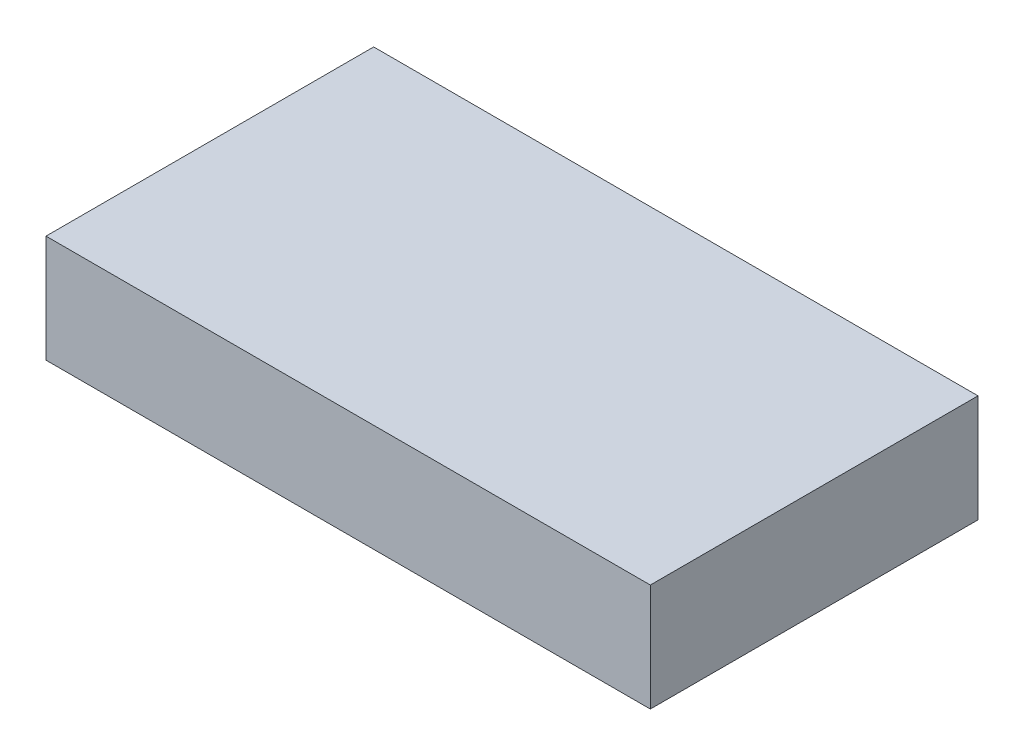
ISO-10303-21;
HEADER;
FILE_DESCRIPTION(('STEP AP214'),'2;1');
FILE_NAME('part.step','',(''),(''),'','','');
FILE_SCHEMA(('AUTOMOTIVE_DESIGN { 1 0 10303 214 1 1 1 1 }'));
ENDSEC;
DATA;
#1=APPLICATION_CONTEXT('core data for automotive mechanical design processes');
#2=APPLICATION_PROTOCOL_DEFINITION('international standard','automotive_design',2000,#1);
#3=PRODUCT_CONTEXT('',#1,'mechanical');
#4=PRODUCT('Part','Part','',(#3));
#5=PRODUCT_RELATED_PRODUCT_CATEGORY('part','',(#4));
#6=PRODUCT_DEFINITION_FORMATION('','',#4);
#7=PRODUCT_DEFINITION_CONTEXT('part definition',#1,'design');
#8=PRODUCT_DEFINITION('design','',#6,#7);
#9=PRODUCT_DEFINITION_SHAPE('','',#8);
#10=(LENGTH_UNIT() NAMED_UNIT(*) SI_UNIT(.MILLI.,.METRE.));
#11=(NAMED_UNIT(*) PLANE_ANGLE_UNIT() SI_UNIT($,.RADIAN.));
#12=(NAMED_UNIT(*) SI_UNIT($,.STERADIAN.) SOLID_ANGLE_UNIT());
#13=UNCERTAINTY_MEASURE_WITH_UNIT(LENGTH_MEASURE(1.E-05),#10,'distance_accuracy_value','');
#14=(GEOMETRIC_REPRESENTATION_CONTEXT(3) GLOBAL_UNCERTAINTY_ASSIGNED_CONTEXT((#13)) GLOBAL_UNIT_ASSIGNED_CONTEXT((#10,
#11,#12)) REPRESENTATION_CONTEXT('',''));
#15=CARTESIAN_POINT('',(0.,0.,0.));
#16=DIRECTION('',(0.,0.,1.));
#17=DIRECTION('',(1.,0.,0.));
#18=AXIS2_PLACEMENT_3D('',#15,#16,#17);
#19=CARTESIAN_POINT('',(-5.625,2.,3.05));
#20=DIRECTION('',(1.,0.,0.));
#21=DIRECTION('',(0.,0.,-1.));
#22=AXIS2_PLACEMENT_3D('',#19,#20,#21);
#23=PLANE('',#22);
#24=DIRECTION('',(0.,0.,1.));
#25=VECTOR('',#24,1.);
#26=CARTESIAN_POINT('',(-5.625,0.,3.05));
#27=LINE('',#26,#25);
#28=CARTESIAN_POINT('',(-5.625,0.,-3.05));
#29=VERTEX_POINT('',#28);
#30=CARTESIAN_POINT('',(-5.625,0.,3.05));
#31=VERTEX_POINT('',#30);
#32=EDGE_CURVE('E137',#29,#31,#27,.T.);
#33=ORIENTED_EDGE('',*,*,#32,.T.);
#34=DIRECTION('',(0.,-1.,0.));
#35=VECTOR('',#34,1.);
#36=CARTESIAN_POINT('',(-5.625,2.,3.05));
#37=LINE('',#36,#35);
#38=CARTESIAN_POINT('',(-5.625,2.,3.05));
#39=VERTEX_POINT('',#38);
#40=EDGE_CURVE('E162',#39,#31,#37,.T.);
#41=ORIENTED_EDGE('',*,*,#40,.F.);
#42=DIRECTION('',(0.,0.,1.));
#43=VECTOR('',#42,1.);
#44=CARTESIAN_POINT('',(-5.625,2.,3.05));
#45=LINE('',#44,#43);
#46=CARTESIAN_POINT('',(-5.625,2.,-3.05));
#47=VERTEX_POINT('',#46);
#48=EDGE_CURVE('E139',#47,#39,#45,.T.);
#49=ORIENTED_EDGE('',*,*,#48,.F.);
#50=DIRECTION('',(0.,-1.,0.));
#51=VECTOR('',#50,1.);
#52=CARTESIAN_POINT('',(-5.625,2.,-3.05));
#53=LINE('',#52,#51);
#54=EDGE_CURVE('E146',#47,#29,#53,.T.);
#55=ORIENTED_EDGE('',*,*,#54,.T.);
#56=EDGE_LOOP('',(#33,#41,#49,#55));
#57=FACE_BOUND('',#56,.T.);
#58=ADVANCED_FACE('F34',(#57),#23,.F.);
#59=CARTESIAN_POINT('',(5.625,2.,3.05));
#60=DIRECTION('',(0.,0.,-1.));
#61=DIRECTION('',(-1.,0.,0.));
#62=AXIS2_PLACEMENT_3D('',#59,#60,#61);
#63=PLANE('',#62);
#64=DIRECTION('',(1.,0.,0.));
#65=VECTOR('',#64,1.);
#66=CARTESIAN_POINT('',(5.625,0.,3.05));
#67=LINE('',#66,#65);
#68=CARTESIAN_POINT('',(5.625,0.,3.05));
#69=VERTEX_POINT('',#68);
#70=EDGE_CURVE('E149',#31,#69,#67,.T.);
#71=ORIENTED_EDGE('',*,*,#70,.T.);
#72=DIRECTION('',(0.,-1.,0.));
#73=VECTOR('',#72,1.);
#74=CARTESIAN_POINT('',(5.625,2.,3.05));
#75=LINE('',#74,#73);
#76=CARTESIAN_POINT('',(5.625,2.,3.05));
#77=VERTEX_POINT('',#76);
#78=EDGE_CURVE('E159',#77,#69,#75,.T.);
#79=ORIENTED_EDGE('',*,*,#78,.F.);
#80=DIRECTION('',(1.,0.,0.));
#81=VECTOR('',#80,1.);
#82=CARTESIAN_POINT('',(5.625,2.,3.05));
#83=LINE('',#82,#81);
#84=EDGE_CURVE('E87',#39,#77,#83,.T.);
#85=ORIENTED_EDGE('',*,*,#84,.F.);
#86=ORIENTED_EDGE('',*,*,#40,.T.);
#87=EDGE_LOOP('',(#71,#79,#85,#86));
#88=FACE_BOUND('',#87,.T.);
#89=ADVANCED_FACE('F209',(#88),#63,.F.);
#90=CARTESIAN_POINT('',(5.625,2.,3.05));
#91=DIRECTION('',(-1.,0.,0.));
#92=DIRECTION('',(0.,0.,1.));
#93=AXIS2_PLACEMENT_3D('',#90,#91,#92);
#94=PLANE('',#93);
#95=DIRECTION('',(0.,0.,-1.));
#96=VECTOR('',#95,1.);
#97=CARTESIAN_POINT('',(5.625,0.,3.05));
#98=LINE('',#97,#96);
#99=CARTESIAN_POINT('',(5.625,0.,-3.05));
#100=VERTEX_POINT('',#99);
#101=EDGE_CURVE('E151',#69,#100,#98,.T.);
#102=ORIENTED_EDGE('',*,*,#101,.T.);
#103=DIRECTION('',(0.,-1.,0.));
#104=VECTOR('',#103,1.);
#105=CARTESIAN_POINT('',(5.625,2.,-3.05));
#106=LINE('',#105,#104);
#107=CARTESIAN_POINT('',(5.625,2.,-3.05));
#108=VERTEX_POINT('',#107);
#109=EDGE_CURVE('E156',#108,#100,#106,.T.);
#110=ORIENTED_EDGE('',*,*,#109,.F.);
#111=DIRECTION('',(0.,0.,-1.));
#112=VECTOR('',#111,1.);
#113=CARTESIAN_POINT('',(5.625,2.,3.05));
#114=LINE('',#113,#112);
#115=EDGE_CURVE('E143',#77,#108,#114,.T.);
#116=ORIENTED_EDGE('',*,*,#115,.F.);
#117=ORIENTED_EDGE('',*,*,#78,.T.);
#118=EDGE_LOOP('',(#102,#110,#116,#117));
#119=FACE_BOUND('',#118,.T.);
#120=ADVANCED_FACE('F215',(#119),#94,.F.);
#121=CARTESIAN_POINT('',(5.625,2.,-3.05));
#122=DIRECTION('',(0.,0.,1.));
#123=DIRECTION('',(1.,0.,0.));
#124=AXIS2_PLACEMENT_3D('',#121,#122,#123);
#125=PLANE('',#124);
#126=DIRECTION('',(-1.,0.,0.));
#127=VECTOR('',#126,1.);
#128=CARTESIAN_POINT('',(5.625,0.,-3.05));
#129=LINE('',#128,#127);
#130=CARTESIAN_POINT('',(5.3075,0.,-3.05));
#131=VERTEX_POINT('',#130);
#132=EDGE_CURVE('E141',#100,#131,#129,.T.);
#133=ORIENTED_EDGE('',*,*,#132,.T.);
#134=DIRECTION('',(0.,-1.,0.));
#135=VECTOR('',#134,1.);
#136=CARTESIAN_POINT('',(5.3075,-1.365,-3.05));
#137=LINE('',#136,#135);
#138=CARTESIAN_POINT('',(5.3075,1.365,-3.05));
#139=VERTEX_POINT('',#138);
#140=EDGE_CURVE('E131',#139,#131,#137,.T.);
#141=ORIENTED_EDGE('',*,*,#140,.F.);
#142=DIRECTION('',(1.,0.,0.));
#143=VECTOR('',#142,1.);
#144=CARTESIAN_POINT('',(-5.3075,1.365,-3.05));
#145=LINE('',#144,#143);
#146=CARTESIAN_POINT('',(-5.3075,1.365,-3.05));
#147=VERTEX_POINT('',#146);
#148=EDGE_CURVE('E135',#147,#139,#145,.T.);
#149=ORIENTED_EDGE('',*,*,#148,.F.);
#150=DIRECTION('',(0.,1.,0.));
#151=VECTOR('',#150,1.);
#152=CARTESIAN_POINT('',(-5.3075,-1.365,-3.05));
#153=LINE('',#152,#151);
#154=CARTESIAN_POINT('',(-5.3075,0.,-3.05));
#155=VERTEX_POINT('',#154);
#156=EDGE_CURVE('E121',#155,#147,#153,.T.);
#157=ORIENTED_EDGE('',*,*,#156,.F.);
#158=EDGE_CURVE('E79',#155,#29,#129,.T.);
#159=ORIENTED_EDGE('',*,*,#158,.T.);
#160=ORIENTED_EDGE('',*,*,#54,.F.);
#161=DIRECTION('',(-1.,0.,0.));
#162=VECTOR('',#161,1.);
#163=CARTESIAN_POINT('',(5.625,2.,-3.05));
#164=LINE('',#163,#162);
#165=EDGE_CURVE('E58',#108,#47,#164,.T.);
#166=ORIENTED_EDGE('',*,*,#165,.F.);
#167=ORIENTED_EDGE('',*,*,#109,.T.);
#168=EDGE_LOOP('',(#133,#141,#149,#157,#159,#160,#166,#167));
#169=FACE_BOUND('',#168,.T.);
#170=ADVANCED_FACE('F281',(#169),#125,.F.);
#171=CARTESIAN_POINT('',(0.,2.,0.));
#172=DIRECTION('',(0.,1.,0.));
#173=DIRECTION('',(0.,0.,1.));
#174=AXIS2_PLACEMENT_3D('',#171,#172,#173);
#175=PLANE('',#174);
#176=ORIENTED_EDGE('',*,*,#48,.T.);
#177=ORIENTED_EDGE('',*,*,#84,.T.);
#178=ORIENTED_EDGE('',*,*,#115,.T.);
#179=ORIENTED_EDGE('',*,*,#165,.T.);
#180=EDGE_LOOP('',(#176,#177,#178,#179));
#181=FACE_BOUND('',#180,.T.);
#182=ADVANCED_FACE('F278',(#181),#175,.T.);
#183=CARTESIAN_POINT('',(0.,0.,0.));
#184=DIRECTION('',(0.,1.,0.));
#185=DIRECTION('',(0.,0.,1.));
#186=AXIS2_PLACEMENT_3D('',#183,#184,#185);
#187=PLANE('',#186);
#188=DIRECTION('',(-1.,0.,0.));
#189=VECTOR('',#188,1.);
#190=CARTESIAN_POINT('',(0.,0.,0.76));
#191=LINE('',#190,#189);
#192=CARTESIAN_POINT('',(5.3075,0.,0.759999999999999));
#193=VERTEX_POINT('',#192);
#194=CARTESIAN_POINT('',(-5.3075,0.,0.760000000000001));
#195=VERTEX_POINT('',#194);
#196=EDGE_CURVE('E114',#193,#195,#191,.T.);
#197=ORIENTED_EDGE('',*,*,#196,.F.);
#198=DIRECTION('',(0.,0.,-1.));
#199=VECTOR('',#198,1.);
#200=CARTESIAN_POINT('',(5.3075,0.,0.));
#201=LINE('',#200,#199);
#202=EDGE_CURVE('E167',#193,#131,#201,.T.);
#203=ORIENTED_EDGE('',*,*,#202,.T.);
#204=ORIENTED_EDGE('',*,*,#132,.F.);
#205=ORIENTED_EDGE('',*,*,#101,.F.);
#206=ORIENTED_EDGE('',*,*,#70,.F.);
#207=ORIENTED_EDGE('',*,*,#32,.F.);
#208=ORIENTED_EDGE('',*,*,#158,.F.);
#209=DIRECTION('',(0.,0.,1.));
#210=VECTOR('',#209,1.);
#211=CARTESIAN_POINT('',(-5.3075,0.,0.));
#212=LINE('',#211,#210);
#213=EDGE_CURVE('E165',#155,#195,#212,.T.);
#214=ORIENTED_EDGE('',*,*,#213,.T.);
#215=EDGE_LOOP('',(#197,#203,#204,#205,#206,#207,#208,#214));
#216=FACE_BOUND('',#215,.T.);
#217=ADVANCED_FACE('F276',(#216),#187,.F.);
#218=CARTESIAN_POINT('',(5.3075,-1.365,0.759999999999999));
#219=DIRECTION('',(1.,0.,0.));
#220=DIRECTION('',(0.,0.,-1.));
#221=AXIS2_PLACEMENT_3D('',#218,#219,#220);
#222=PLANE('',#221);
#223=DIRECTION('',(0.,-1.,0.));
#224=VECTOR('',#223,1.);
#225=CARTESIAN_POINT('',(5.3075,-1.365,0.759999999999999));
#226=LINE('',#225,#224);
#227=CARTESIAN_POINT('',(5.3075,1.365,0.759999999999999));
#228=VERTEX_POINT('',#227);
#229=EDGE_CURVE('E49',#228,#193,#226,.T.);
#230=ORIENTED_EDGE('',*,*,#229,.F.);
#231=DIRECTION('',(0.,0.,-1.));
#232=VECTOR('',#231,1.);
#233=CARTESIAN_POINT('',(5.3075,1.365,0.759999999999999));
#234=LINE('',#233,#232);
#235=EDGE_CURVE('E125',#228,#139,#234,.T.);
#236=ORIENTED_EDGE('',*,*,#235,.T.);
#237=ORIENTED_EDGE('',*,*,#140,.T.);
#238=ORIENTED_EDGE('',*,*,#202,.F.);
#239=EDGE_LOOP('',(#230,#236,#237,#238));
#240=FACE_BOUND('',#239,.T.);
#241=ADVANCED_FACE('F267',(#240),#222,.F.);
#242=CARTESIAN_POINT('',(-5.3075,-1.365,0.760000000000001));
#243=DIRECTION('',(-1.,0.,0.));
#244=DIRECTION('',(0.,0.,1.));
#245=AXIS2_PLACEMENT_3D('',#242,#243,#244);
#246=PLANE('',#245);
#247=ORIENTED_EDGE('',*,*,#156,.T.);
#248=DIRECTION('',(0.,0.,-1.));
#249=VECTOR('',#248,1.);
#250=CARTESIAN_POINT('',(-5.3075,1.365,0.760000000000001));
#251=LINE('',#250,#249);
#252=CARTESIAN_POINT('',(-5.3075,1.365,0.760000000000001));
#253=VERTEX_POINT('',#252);
#254=EDGE_CURVE('E119',#253,#147,#251,.T.);
#255=ORIENTED_EDGE('',*,*,#254,.F.);
#256=DIRECTION('',(0.,1.,0.));
#257=VECTOR('',#256,1.);
#258=CARTESIAN_POINT('',(-5.3075,-1.365,0.760000000000001));
#259=LINE('',#258,#257);
#260=EDGE_CURVE('E108',#195,#253,#259,.T.);
#261=ORIENTED_EDGE('',*,*,#260,.F.);
#262=ORIENTED_EDGE('',*,*,#213,.F.);
#263=EDGE_LOOP('',(#247,#255,#261,#262));
#264=FACE_BOUND('',#263,.T.);
#265=ADVANCED_FACE('F120',(#264),#246,.F.);
#266=CARTESIAN_POINT('',(0.,0.,0.76));
#267=DIRECTION('',(0.,0.,-1.));
#268=DIRECTION('',(-1.,0.,0.));
#269=AXIS2_PLACEMENT_3D('',#266,#267,#268);
#270=PLANE('',#269);
#271=CARTESIAN_POINT('',(-3.53822,0.682500000000001,0.76));
#272=DIRECTION('',(0.,0.,-1.));
#273=DIRECTION('',(-1.,0.,0.));
#274=AXIS2_PLACEMENT_3D('',#271,#272,#273);
#275=CIRCLE('',#274,0.309051048346779);
#276=CARTESIAN_POINT('',(-3.84727104834678,0.682500000000001,0.76));
#277=VERTEX_POINT('',#276);
#278=EDGE_CURVE('E252',#277,#277,#275,.T.);
#279=ORIENTED_EDGE('',*,*,#278,.F.);
#280=EDGE_LOOP('',(#279));
#281=FACE_BOUND('',#280,.T.);
#282=CARTESIAN_POINT('',(-1.76911,0.682499999999999,0.76));
#283=DIRECTION('',(0.,0.,-1.));
#284=DIRECTION('',(-1.,0.,0.));
#285=AXIS2_PLACEMENT_3D('',#282,#283,#284);
#286=CIRCLE('',#285,0.30905104834678);
#287=CARTESIAN_POINT('',(-2.07816104834678,0.682499999999999,0.76));
#288=VERTEX_POINT('',#287);
#289=EDGE_CURVE('E247',#288,#288,#286,.T.);
#290=ORIENTED_EDGE('',*,*,#289,.F.);
#291=EDGE_LOOP('',(#290));
#292=FACE_BOUND('',#291,.T.);
#293=CARTESIAN_POINT('',(0.,0.6825,0.76));
#294=DIRECTION('',(0.,0.,-1.));
#295=DIRECTION('',(-1.,0.,0.));
#296=AXIS2_PLACEMENT_3D('',#293,#294,#295);
#297=CIRCLE('',#296,0.309051048346779);
#298=CARTESIAN_POINT('',(-0.309051048346779,0.6825,0.76));
#299=VERTEX_POINT('',#298);
#300=EDGE_CURVE('E244',#299,#299,#297,.T.);
#301=ORIENTED_EDGE('',*,*,#300,.F.);
#302=EDGE_LOOP('',(#301));
#303=FACE_BOUND('',#302,.T.);
#304=CARTESIAN_POINT('',(1.76911,0.682499999999998,0.759999999999999));
#305=DIRECTION('',(0.,0.,-1.));
#306=DIRECTION('',(-1.,0.,0.));
#307=AXIS2_PLACEMENT_3D('',#304,#305,#306);
#308=CIRCLE('',#307,0.309051048346779);
#309=CARTESIAN_POINT('',(1.46005895165322,0.682499999999998,0.759999999999999));
#310=VERTEX_POINT('',#309);
#311=EDGE_CURVE('E246',#310,#310,#308,.T.);
#312=ORIENTED_EDGE('',*,*,#311,.F.);
#313=EDGE_LOOP('',(#312));
#314=FACE_BOUND('',#313,.T.);
#315=CARTESIAN_POINT('',(3.53822,0.682499999999999,0.759999999999999));
#316=DIRECTION('',(0.,0.,-1.));
#317=DIRECTION('',(-1.,0.,0.));
#318=AXIS2_PLACEMENT_3D('',#315,#316,#317);
#319=CIRCLE('',#318,0.309051048346779);
#320=CARTESIAN_POINT('',(3.22916895165322,0.682499999999999,0.759999999999999));
#321=VERTEX_POINT('',#320);
#322=EDGE_CURVE('E133',#321,#321,#319,.T.);
#323=ORIENTED_EDGE('',*,*,#322,.F.);
#324=EDGE_LOOP('',(#323));
#325=FACE_BOUND('',#324,.T.);
#326=ORIENTED_EDGE('',*,*,#196,.T.);
#327=ORIENTED_EDGE('',*,*,#260,.T.);
#328=DIRECTION('',(1.,0.,0.));
#329=VECTOR('',#328,1.);
#330=CARTESIAN_POINT('',(-5.3075,1.365,0.760000000000001));
#331=LINE('',#330,#329);
#332=EDGE_CURVE('E112',#253,#228,#331,.T.);
#333=ORIENTED_EDGE('',*,*,#332,.T.);
#334=ORIENTED_EDGE('',*,*,#229,.T.);
#335=EDGE_LOOP('',(#326,#327,#333,#334));
#336=FACE_BOUND('',#335,.T.);
#337=ADVANCED_FACE('F110',(#281,#292,#303,#314,#325,#336),#270,.T.);
#338=CARTESIAN_POINT('',(-5.3075,1.365,0.760000000000001));
#339=DIRECTION('',(0.,1.,0.));
#340=DIRECTION('',(0.,0.,1.));
#341=AXIS2_PLACEMENT_3D('',#338,#339,#340);
#342=PLANE('',#341);
#343=ORIENTED_EDGE('',*,*,#148,.T.);
#344=ORIENTED_EDGE('',*,*,#235,.F.);
#345=ORIENTED_EDGE('',*,*,#332,.F.);
#346=ORIENTED_EDGE('',*,*,#254,.T.);
#347=EDGE_LOOP('',(#343,#344,#345,#346));
#348=FACE_BOUND('',#347,.T.);
#349=ADVANCED_FACE('F127',(#348),#342,.F.);
#350=CARTESIAN_POINT('',(3.53822,0.682499999999999,-3.92412836807528));
#351=DIRECTION('',(0.,0.,1.));
#352=DIRECTION('',(1.,0.,0.));
#353=AXIS2_PLACEMENT_3D('',#350,#351,#352);
#354=CYLINDRICAL_SURFACE('',#353,0.309051048346779);
#355=CARTESIAN_POINT('',(3.53822,0.682499999999999,-2.796));
#356=DIRECTION('',(0.,0.,1.));
#357=DIRECTION('',(1.,0.,0.));
#358=AXIS2_PLACEMENT_3D('',#355,#356,#357);
#359=CIRCLE('',#358,0.309051048346779);
#360=CARTESIAN_POINT('',(3.84727104834678,0.682499999999999,-2.796));
#361=VERTEX_POINT('',#360);
#362=EDGE_CURVE('E42',#361,#361,#359,.T.);
#363=ORIENTED_EDGE('',*,*,#362,.T.);
#364=EDGE_LOOP('',(#363));
#365=FACE_BOUND('',#364,.T.);
#366=ORIENTED_EDGE('',*,*,#322,.T.);
#367=EDGE_LOOP('',(#366));
#368=FACE_BOUND('',#367,.T.);
#369=ADVANCED_FACE('F196',(#365,#368),#354,.T.);
#370=CARTESIAN_POINT('',(5.625,2.,-3.05));
#371=DIRECTION('',(0.,0.,1.));
#372=DIRECTION('',(1.,0.,0.));
#373=AXIS2_PLACEMENT_3D('',#370,#371,#372);
#374=PLANE('',#373);
#375=CARTESIAN_POINT('',(3.53822,0.682499999999999,-3.05));
#376=DIRECTION('',(0.,0.,1.));
#377=DIRECTION('',(1.,0.,0.));
#378=AXIS2_PLACEMENT_3D('',#375,#376,#377);
#379=CIRCLE('',#378,0.0550510483467794);
#380=CARTESIAN_POINT('',(3.59327104834678,0.682499999999999,-3.05));
#381=VERTEX_POINT('',#380);
#382=EDGE_CURVE('E11',#381,#381,#379,.F.);
#383=ORIENTED_EDGE('',*,*,#382,.T.);
#384=EDGE_LOOP('',(#383));
#385=FACE_BOUND('',#384,.T.);
#386=ADVANCED_FACE('F339',(#385),#374,.F.);
#387=CARTESIAN_POINT('',(1.76911,0.682499999999998,-3.92412836807528));
#388=DIRECTION('',(0.,0.,1.));
#389=DIRECTION('',(1.,0.,0.));
#390=AXIS2_PLACEMENT_3D('',#387,#388,#389);
#391=CYLINDRICAL_SURFACE('',#390,0.309051048346779);
#392=CARTESIAN_POINT('',(1.76911,0.682499999999998,-2.796));
#393=DIRECTION('',(0.,0.,1.));
#394=DIRECTION('',(1.,0.,0.));
#395=AXIS2_PLACEMENT_3D('',#392,#393,#394);
#396=CIRCLE('',#395,0.309051048346779);
#397=CARTESIAN_POINT('',(2.07816104834678,0.682499999999998,-2.796));
#398=VERTEX_POINT('',#397);
#399=EDGE_CURVE('E188',#398,#398,#396,.T.);
#400=ORIENTED_EDGE('',*,*,#399,.T.);
#401=EDGE_LOOP('',(#400));
#402=FACE_BOUND('',#401,.T.);
#403=ORIENTED_EDGE('',*,*,#311,.T.);
#404=EDGE_LOOP('',(#403));
#405=FACE_BOUND('',#404,.T.);
#406=ADVANCED_FACE('F347',(#402,#405),#391,.T.);
#407=CARTESIAN_POINT('',(5.625,2.,-3.05));
#408=DIRECTION('',(0.,0.,1.));
#409=DIRECTION('',(1.,0.,0.));
#410=AXIS2_PLACEMENT_3D('',#407,#408,#409);
#411=PLANE('',#410);
#412=CARTESIAN_POINT('',(1.76911,0.682499999999998,-3.05));
#413=DIRECTION('',(0.,0.,1.));
#414=DIRECTION('',(1.,0.,0.));
#415=AXIS2_PLACEMENT_3D('',#412,#413,#414);
#416=CIRCLE('',#415,0.0550510483467791);
#417=CARTESIAN_POINT('',(1.82416104834678,0.682499999999998,-3.05));
#418=VERTEX_POINT('',#417);
#419=EDGE_CURVE('E191',#418,#418,#416,.F.);
#420=ORIENTED_EDGE('',*,*,#419,.T.);
#421=EDGE_LOOP('',(#420));
#422=FACE_BOUND('',#421,.T.);
#423=ADVANCED_FACE('F240',(#422),#411,.F.);
#424=CARTESIAN_POINT('',(0.,0.6825,-3.92412836807528));
#425=DIRECTION('',(0.,0.,1.));
#426=DIRECTION('',(1.,0.,0.));
#427=AXIS2_PLACEMENT_3D('',#424,#425,#426);
#428=CYLINDRICAL_SURFACE('',#427,0.309051048346779);
#429=CARTESIAN_POINT('',(0.,0.6825,-2.796));
#430=DIRECTION('',(0.,0.,1.));
#431=DIRECTION('',(1.,0.,0.));
#432=AXIS2_PLACEMENT_3D('',#429,#430,#431);
#433=CIRCLE('',#432,0.309051048346779);
#434=CARTESIAN_POINT('',(0.309051048346779,0.6825,-2.796));
#435=VERTEX_POINT('',#434);
#436=EDGE_CURVE('E182',#435,#435,#433,.T.);
#437=ORIENTED_EDGE('',*,*,#436,.T.);
#438=EDGE_LOOP('',(#437));
#439=FACE_BOUND('',#438,.T.);
#440=ORIENTED_EDGE('',*,*,#300,.T.);
#441=EDGE_LOOP('',(#440));
#442=FACE_BOUND('',#441,.T.);
#443=ADVANCED_FACE('F236',(#439,#442),#428,.T.);
#444=CARTESIAN_POINT('',(5.625,2.,-3.05));
#445=DIRECTION('',(0.,0.,1.));
#446=DIRECTION('',(1.,0.,0.));
#447=AXIS2_PLACEMENT_3D('',#444,#445,#446);
#448=PLANE('',#447);
#449=CARTESIAN_POINT('',(0.,0.6825,-3.05));
#450=DIRECTION('',(0.,0.,1.));
#451=DIRECTION('',(1.,0.,0.));
#452=AXIS2_PLACEMENT_3D('',#449,#450,#451);
#453=CIRCLE('',#452,0.0550510483467792);
#454=CARTESIAN_POINT('',(0.0550510483467787,0.6825,-3.05));
#455=VERTEX_POINT('',#454);
#456=EDGE_CURVE('E185',#455,#455,#453,.F.);
#457=ORIENTED_EDGE('',*,*,#456,.T.);
#458=EDGE_LOOP('',(#457));
#459=FACE_BOUND('',#458,.T.);
#460=ADVANCED_FACE('F239',(#459),#448,.F.);
#461=CARTESIAN_POINT('',(-1.76911,0.682499999999999,-3.92412836807528));
#462=DIRECTION('',(0.,0.,1.));
#463=DIRECTION('',(1.,0.,0.));
#464=AXIS2_PLACEMENT_3D('',#461,#462,#463);
#465=CYLINDRICAL_SURFACE('',#464,0.30905104834678);
#466=CARTESIAN_POINT('',(-1.76911,0.682499999999999,-2.796));
#467=DIRECTION('',(0.,0.,1.));
#468=DIRECTION('',(1.,0.,0.));
#469=AXIS2_PLACEMENT_3D('',#466,#467,#468);
#470=CIRCLE('',#469,0.30905104834678);
#471=CARTESIAN_POINT('',(-1.46005895165322,0.682499999999999,-2.796));
#472=VERTEX_POINT('',#471);
#473=EDGE_CURVE('E176',#472,#472,#470,.T.);
#474=ORIENTED_EDGE('',*,*,#473,.T.);
#475=EDGE_LOOP('',(#474));
#476=FACE_BOUND('',#475,.T.);
#477=ORIENTED_EDGE('',*,*,#289,.T.);
#478=EDGE_LOOP('',(#477));
#479=FACE_BOUND('',#478,.T.);
#480=ADVANCED_FACE('F380',(#476,#479),#465,.T.);
#481=CARTESIAN_POINT('',(5.625,2.,-3.05));
#482=DIRECTION('',(0.,0.,1.));
#483=DIRECTION('',(1.,0.,0.));
#484=AXIS2_PLACEMENT_3D('',#481,#482,#483);
#485=PLANE('',#484);
#486=CARTESIAN_POINT('',(-1.76911,0.682499999999999,-3.05));
#487=DIRECTION('',(0.,0.,1.));
#488=DIRECTION('',(1.,0.,0.));
#489=AXIS2_PLACEMENT_3D('',#486,#487,#488);
#490=CIRCLE('',#489,0.0550510483467796);
#491=CARTESIAN_POINT('',(-1.71405895165322,0.682499999999999,-3.05));
#492=VERTEX_POINT('',#491);
#493=EDGE_CURVE('E179',#492,#492,#490,.F.);
#494=ORIENTED_EDGE('',*,*,#493,.T.);
#495=EDGE_LOOP('',(#494));
#496=FACE_BOUND('',#495,.T.);
#497=ADVANCED_FACE('F390',(#496),#485,.F.);
#498=CARTESIAN_POINT('',(-3.53822,0.682500000000001,-3.92412836807528));
#499=DIRECTION('',(0.,0.,1.));
#500=DIRECTION('',(1.,0.,0.));
#501=AXIS2_PLACEMENT_3D('',#498,#499,#500);
#502=CYLINDRICAL_SURFACE('',#501,0.309051048346779);
#503=CARTESIAN_POINT('',(-3.53822,0.682500000000001,-2.796));
#504=DIRECTION('',(0.,0.,1.));
#505=DIRECTION('',(1.,0.,0.));
#506=AXIS2_PLACEMENT_3D('',#503,#504,#505);
#507=CIRCLE('',#506,0.309051048346779);
#508=CARTESIAN_POINT('',(-3.22916895165322,0.682500000000001,-2.796));
#509=VERTEX_POINT('',#508);
#510=EDGE_CURVE('E170',#509,#509,#507,.T.);
#511=ORIENTED_EDGE('',*,*,#510,.T.);
#512=EDGE_LOOP('',(#511));
#513=FACE_BOUND('',#512,.T.);
#514=ORIENTED_EDGE('',*,*,#278,.T.);
#515=EDGE_LOOP('',(#514));
#516=FACE_BOUND('',#515,.T.);
#517=ADVANCED_FACE('F400',(#513,#516),#502,.T.);
#518=CARTESIAN_POINT('',(5.625,2.,-3.05));
#519=DIRECTION('',(0.,0.,1.));
#520=DIRECTION('',(1.,0.,0.));
#521=AXIS2_PLACEMENT_3D('',#518,#519,#520);
#522=PLANE('',#521);
#523=CARTESIAN_POINT('',(-3.53822,0.682500000000001,-3.05));
#524=DIRECTION('',(0.,0.,1.));
#525=DIRECTION('',(1.,0.,0.));
#526=AXIS2_PLACEMENT_3D('',#523,#524,#525);
#527=CIRCLE('',#526,0.0550510483467794);
#528=CARTESIAN_POINT('',(-3.48316895165322,0.682500000000001,-3.05));
#529=VERTEX_POINT('',#528);
#530=EDGE_CURVE('E173',#529,#529,#527,.F.);
#531=ORIENTED_EDGE('',*,*,#530,.T.);
#532=EDGE_LOOP('',(#531));
#533=FACE_BOUND('',#532,.T.);
#534=ADVANCED_FACE('F223',(#533),#522,.F.);
#535=CARTESIAN_POINT('',(-3.53822,0.682500000000001,-2.796));
#536=DIRECTION('',(0.,0.,1.));
#537=DIRECTION('',(1.,0.,0.));
#538=AXIS2_PLACEMENT_3D('',#535,#536,#537);
#539=DEGENERATE_TOROIDAL_SURFACE('',#538,0.0550510483467794,0.254,.T.);
#540=ORIENTED_EDGE('',*,*,#530,.F.);
#541=EDGE_LOOP('',(#540));
#542=FACE_BOUND('',#541,.T.);
#543=ORIENTED_EDGE('',*,*,#510,.F.);
#544=EDGE_LOOP('',(#543));
#545=FACE_BOUND('',#544,.T.);
#546=ADVANCED_FACE('F219',(#542,#545),#539,.T.);
#547=CARTESIAN_POINT('',(-1.76911,0.682499999999999,-2.796));
#548=DIRECTION('',(0.,0.,1.));
#549=DIRECTION('',(1.,0.,0.));
#550=AXIS2_PLACEMENT_3D('',#547,#548,#549);
#551=DEGENERATE_TOROIDAL_SURFACE('',#550,0.0550510483467796,0.254,.T.);
#552=ORIENTED_EDGE('',*,*,#493,.F.);
#553=EDGE_LOOP('',(#552));
#554=FACE_BOUND('',#553,.T.);
#555=ORIENTED_EDGE('',*,*,#473,.F.);
#556=EDGE_LOOP('',(#555));
#557=FACE_BOUND('',#556,.T.);
#558=ADVANCED_FACE('F222',(#554,#557),#551,.T.);
#559=CARTESIAN_POINT('',(0.,0.6825,-2.796));
#560=DIRECTION('',(0.,0.,1.));
#561=DIRECTION('',(1.,0.,0.));
#562=AXIS2_PLACEMENT_3D('',#559,#560,#561);
#563=DEGENERATE_TOROIDAL_SURFACE('',#562,0.0550510483467792,0.254,.T.);
#564=ORIENTED_EDGE('',*,*,#456,.F.);
#565=EDGE_LOOP('',(#564));
#566=FACE_BOUND('',#565,.T.);
#567=ORIENTED_EDGE('',*,*,#436,.F.);
#568=EDGE_LOOP('',(#567));
#569=FACE_BOUND('',#568,.T.);
#570=ADVANCED_FACE('F205',(#566,#569),#563,.T.);
#571=CARTESIAN_POINT('',(1.76911,0.682499999999998,-2.796));
#572=DIRECTION('',(0.,0.,1.));
#573=DIRECTION('',(1.,0.,0.));
#574=AXIS2_PLACEMENT_3D('',#571,#572,#573);
#575=DEGENERATE_TOROIDAL_SURFACE('',#574,0.0550510483467791,0.254,.T.);
#576=ORIENTED_EDGE('',*,*,#419,.F.);
#577=EDGE_LOOP('',(#576));
#578=FACE_BOUND('',#577,.T.);
#579=ORIENTED_EDGE('',*,*,#399,.F.);
#580=EDGE_LOOP('',(#579));
#581=FACE_BOUND('',#580,.T.);
#582=ADVANCED_FACE('F200',(#578,#581),#575,.T.);
#583=CARTESIAN_POINT('',(3.53822,0.682499999999999,-2.796));
#584=DIRECTION('',(0.,0.,1.));
#585=DIRECTION('',(1.,0.,0.));
#586=AXIS2_PLACEMENT_3D('',#583,#584,#585);
#587=DEGENERATE_TOROIDAL_SURFACE('',#586,0.0550510483467794,0.254,.T.);
#588=ORIENTED_EDGE('',*,*,#382,.F.);
#589=EDGE_LOOP('',(#588));
#590=FACE_BOUND('',#589,.T.);
#591=ORIENTED_EDGE('',*,*,#362,.F.);
#592=EDGE_LOOP('',(#591));
#593=FACE_BOUND('',#592,.T.);
#594=ADVANCED_FACE('F36',(#590,#593),#587,.T.);
#595=CLOSED_SHELL('',(#58,#89,#120,#170,#182,#217,#241,#265,#337,#349,#369,#386,#406,#423,#443,
#460,#480,#497,#517,#534,#546,#558,#570,#582,#594));
#596=MANIFOLD_SOLID_BREP('B2',#595);
#597=ADVANCED_BREP_SHAPE_REPRESENTATION('',(#18,#596),#14);
#598=SHAPE_DEFINITION_REPRESENTATION(#9,#597);
ENDSEC;
END-ISO-10303-21;
